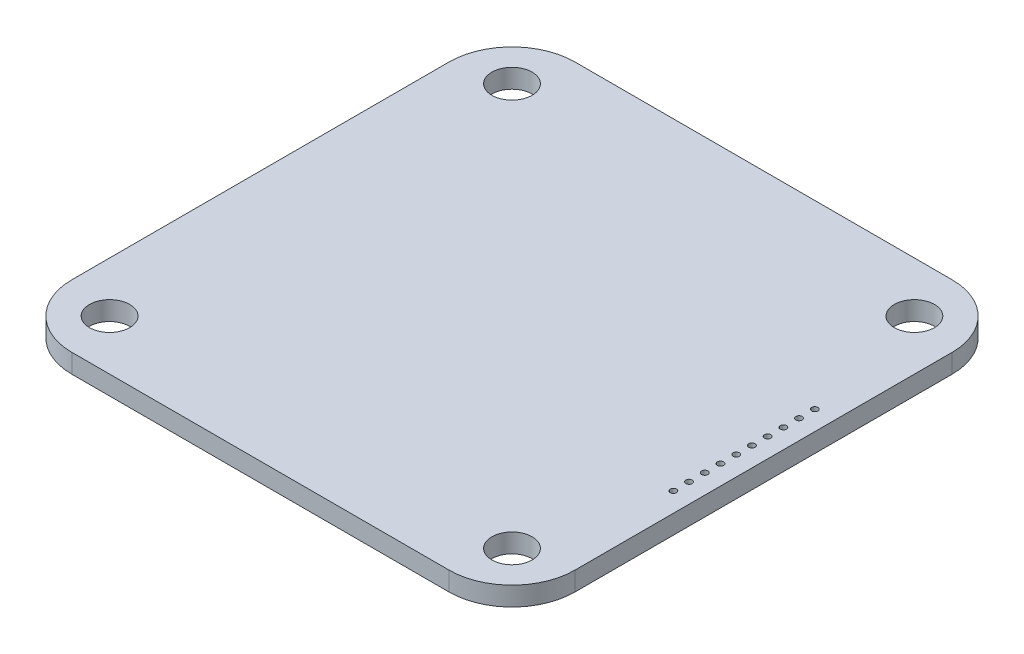
ISO-10303-21;
HEADER;
FILE_DESCRIPTION(('STEP AP214'),'2;1');
FILE_NAME('part.step','',(''),(''),'','','');
FILE_SCHEMA(('AUTOMOTIVE_DESIGN { 1 0 10303 214 1 1 1 1 }'));
ENDSEC;
DATA;
#1=APPLICATION_CONTEXT('core data for automotive mechanical design processes');
#2=APPLICATION_PROTOCOL_DEFINITION('international standard','automotive_design',2000,#1);
#3=PRODUCT_CONTEXT('',#1,'mechanical');
#4=PRODUCT('Part','Part','',(#3));
#5=PRODUCT_RELATED_PRODUCT_CATEGORY('part','',(#4));
#6=PRODUCT_DEFINITION_FORMATION('','',#4);
#7=PRODUCT_DEFINITION_CONTEXT('part definition',#1,'design');
#8=PRODUCT_DEFINITION('design','',#6,#7);
#9=PRODUCT_DEFINITION_SHAPE('','',#8);
#10=(LENGTH_UNIT() NAMED_UNIT(*) SI_UNIT(.MILLI.,.METRE.));
#11=(NAMED_UNIT(*) PLANE_ANGLE_UNIT() SI_UNIT($,.RADIAN.));
#12=(NAMED_UNIT(*) SI_UNIT($,.STERADIAN.) SOLID_ANGLE_UNIT());
#13=UNCERTAINTY_MEASURE_WITH_UNIT(LENGTH_MEASURE(1.E-05),#10,'distance_accuracy_value','');
#14=(GEOMETRIC_REPRESENTATION_CONTEXT(3) GLOBAL_UNCERTAINTY_ASSIGNED_CONTEXT((#13)) GLOBAL_UNIT_ASSIGNED_CONTEXT((#10,
#11,#12)) REPRESENTATION_CONTEXT('',''));
#15=CARTESIAN_POINT('',(0.,0.,0.));
#16=DIRECTION('',(0.,0.,1.));
#17=DIRECTION('',(1.,0.,0.));
#18=AXIS2_PLACEMENT_3D('',#15,#16,#17);
#19=CARTESIAN_POINT('',(-10.8501032025423,-7.71899899933052,22.49633549216));
#20=DIRECTION('',(0.,1.,0.));
#21=DIRECTION('',(0.,0.,1.));
#22=AXIS2_PLACEMENT_3D('',#19,#20,#21);
#23=CYLINDRICAL_SURFACE('',#22,1.6);
#24=CARTESIAN_POINT('',(-10.8501032025423,-7.76499899933052,22.49633549216));
#25=DIRECTION('',(0.,1.,0.));
#26=DIRECTION('',(0.,0.,1.));
#27=AXIS2_PLACEMENT_3D('',#24,#25,#26);
#28=CIRCLE('',#27,1.6);
#29=CARTESIAN_POINT('',(-10.8501032025423,-7.76499899933052,24.09633549216));
#30=VERTEX_POINT('',#29);
#31=EDGE_CURVE('E259',#30,#30,#28,.T.);
#32=ORIENTED_EDGE('',*,*,#31,.T.);
#33=EDGE_LOOP('',(#32));
#34=FACE_BOUND('',#33,.T.);
#35=CARTESIAN_POINT('',(-10.8501032025423,-9.27499899933052,22.49633549216));
#36=DIRECTION('',(0.,1.,0.));
#37=DIRECTION('',(0.,0.,1.));
#38=AXIS2_PLACEMENT_3D('',#35,#36,#37);
#39=CIRCLE('',#38,1.6);
#40=CARTESIAN_POINT('',(-10.8501032025423,-9.27499899933052,24.09633549216));
#41=VERTEX_POINT('',#40);
#42=EDGE_CURVE('E225',#41,#41,#39,.T.);
#43=ORIENTED_EDGE('',*,*,#42,.F.);
#44=EDGE_LOOP('',(#43));
#45=FACE_BOUND('',#44,.T.);
#46=ADVANCED_FACE('F16',(#34,#45),#23,.F.);
#47=CARTESIAN_POINT('',(21.1498967974577,-7.7189989993306,22.49633549216));
#48=DIRECTION('',(0.,1.,0.));
#49=DIRECTION('',(0.,0.,1.));
#50=AXIS2_PLACEMENT_3D('',#47,#48,#49);
#51=CYLINDRICAL_SURFACE('',#50,1.6);
#52=CARTESIAN_POINT('',(21.1498967974577,-7.76499899933061,22.49633549216));
#53=DIRECTION('',(0.,1.,0.));
#54=DIRECTION('',(0.,0.,1.));
#55=AXIS2_PLACEMENT_3D('',#52,#53,#54);
#56=CIRCLE('',#55,1.6);
#57=CARTESIAN_POINT('',(21.1498967974577,-7.76499899933061,24.09633549216));
#58=VERTEX_POINT('',#57);
#59=EDGE_CURVE('E254',#58,#58,#56,.T.);
#60=ORIENTED_EDGE('',*,*,#59,.T.);
#61=EDGE_LOOP('',(#60));
#62=FACE_BOUND('',#61,.T.);
#63=CARTESIAN_POINT('',(21.1498967974577,-9.27499899933061,22.49633549216));
#64=DIRECTION('',(0.,1.,0.));
#65=DIRECTION('',(0.,0.,1.));
#66=AXIS2_PLACEMENT_3D('',#63,#64,#65);
#67=CIRCLE('',#66,1.6);
#68=CARTESIAN_POINT('',(21.1498967974577,-9.27499899933061,24.09633549216));
#69=VERTEX_POINT('',#68);
#70=EDGE_CURVE('E226',#69,#69,#67,.T.);
#71=ORIENTED_EDGE('',*,*,#70,.F.);
#72=EDGE_LOOP('',(#71));
#73=FACE_BOUND('',#72,.T.);
#74=ADVANCED_FACE('F340',(#62,#73),#51,.F.);
#75=CARTESIAN_POINT('',(23.6048967974577,-7.71899899933061,32.87133549216));
#76=DIRECTION('',(0.,1.,0.));
#77=DIRECTION('',(0.,0.,1.));
#78=AXIS2_PLACEMENT_3D('',#75,#76,#77);
#79=CYLINDRICAL_SURFACE('',#78,0.25);
#80=CARTESIAN_POINT('',(23.6048967974577,-7.76499899933061,32.87133549216));
#81=DIRECTION('',(0.,1.,0.));
#82=DIRECTION('',(0.,0.,1.));
#83=AXIS2_PLACEMENT_3D('',#80,#81,#82);
#84=CIRCLE('',#83,0.25);
#85=CARTESIAN_POINT('',(23.6048967974577,-7.76499899933061,33.12133549216));
#86=VERTEX_POINT('',#85);
#87=EDGE_CURVE('E253',#86,#86,#84,.T.);
#88=ORIENTED_EDGE('',*,*,#87,.T.);
#89=EDGE_LOOP('',(#88));
#90=FACE_BOUND('',#89,.T.);
#91=CARTESIAN_POINT('',(23.6048967974577,-9.27499899933061,32.87133549216));
#92=DIRECTION('',(0.,1.,0.));
#93=DIRECTION('',(0.,0.,1.));
#94=AXIS2_PLACEMENT_3D('',#91,#92,#93);
#95=CIRCLE('',#94,0.25);
#96=CARTESIAN_POINT('',(23.6048967974577,-9.27499899933061,33.12133549216));
#97=VERTEX_POINT('',#96);
#98=EDGE_CURVE('E250',#97,#97,#95,.T.);
#99=ORIENTED_EDGE('',*,*,#98,.F.);
#100=EDGE_LOOP('',(#99));
#101=FACE_BOUND('',#100,.T.);
#102=ADVANCED_FACE('F343',(#90,#101),#79,.F.);
#103=CARTESIAN_POINT('',(23.6048967974577,-7.71899899933061,34.12133449216));
#104=DIRECTION('',(0.,1.,0.));
#105=DIRECTION('',(0.,0.,1.));
#106=AXIS2_PLACEMENT_3D('',#103,#104,#105);
#107=CYLINDRICAL_SURFACE('',#106,0.25);
#108=CARTESIAN_POINT('',(23.6048967974577,-7.76499899933061,34.12133449216));
#109=DIRECTION('',(0.,1.,0.));
#110=DIRECTION('',(0.,0.,1.));
#111=AXIS2_PLACEMENT_3D('',#108,#109,#110);
#112=CIRCLE('',#111,0.25);
#113=CARTESIAN_POINT('',(23.6048967974577,-7.76499899933061,34.37133449216));
#114=VERTEX_POINT('',#113);
#115=EDGE_CURVE('E245',#114,#114,#112,.T.);
#116=ORIENTED_EDGE('',*,*,#115,.T.);
#117=EDGE_LOOP('',(#116));
#118=FACE_BOUND('',#117,.T.);
#119=CARTESIAN_POINT('',(23.6048967974577,-9.27499899933061,34.12133449216));
#120=DIRECTION('',(0.,1.,0.));
#121=DIRECTION('',(0.,0.,1.));
#122=AXIS2_PLACEMENT_3D('',#119,#120,#121);
#123=CIRCLE('',#122,0.25);
#124=CARTESIAN_POINT('',(23.6048967974577,-9.27499899933061,34.37133449216));
#125=VERTEX_POINT('',#124);
#126=EDGE_CURVE('E242',#125,#125,#123,.T.);
#127=ORIENTED_EDGE('',*,*,#126,.F.);
#128=EDGE_LOOP('',(#127));
#129=FACE_BOUND('',#128,.T.);
#130=ADVANCED_FACE('F425',(#118,#129),#107,.F.);
#131=CARTESIAN_POINT('',(23.6048967974577,-7.71899899933061,35.37133549216));
#132=DIRECTION('',(0.,1.,0.));
#133=DIRECTION('',(0.,0.,1.));
#134=AXIS2_PLACEMENT_3D('',#131,#132,#133);
#135=CYLINDRICAL_SURFACE('',#134,0.25);
#136=CARTESIAN_POINT('',(23.6048967974577,-7.76499899933061,35.37133549216));
#137=DIRECTION('',(0.,1.,0.));
#138=DIRECTION('',(0.,0.,1.));
#139=AXIS2_PLACEMENT_3D('',#136,#137,#138);
#140=CIRCLE('',#139,0.25);
#141=CARTESIAN_POINT('',(23.6048967974577,-7.76499899933061,35.62133549216));
#142=VERTEX_POINT('',#141);
#143=EDGE_CURVE('E238',#142,#142,#140,.T.);
#144=ORIENTED_EDGE('',*,*,#143,.T.);
#145=EDGE_LOOP('',(#144));
#146=FACE_BOUND('',#145,.T.);
#147=CARTESIAN_POINT('',(23.6048967974577,-9.27499899933061,35.37133549216));
#148=DIRECTION('',(0.,1.,0.));
#149=DIRECTION('',(0.,0.,1.));
#150=AXIS2_PLACEMENT_3D('',#147,#148,#149);
#151=CIRCLE('',#150,0.25);
#152=CARTESIAN_POINT('',(23.6048967974577,-9.27499899933061,35.62133549216));
#153=VERTEX_POINT('',#152);
#154=EDGE_CURVE('E164',#153,#153,#151,.T.);
#155=ORIENTED_EDGE('',*,*,#154,.F.);
#156=EDGE_LOOP('',(#155));
#157=FACE_BOUND('',#156,.T.);
#158=ADVANCED_FACE('F416',(#146,#157),#135,.F.);
#159=CARTESIAN_POINT('',(23.6048967974577,-7.71899899933061,36.62133449216));
#160=DIRECTION('',(0.,1.,0.));
#161=DIRECTION('',(0.,0.,1.));
#162=AXIS2_PLACEMENT_3D('',#159,#160,#161);
#163=CYLINDRICAL_SURFACE('',#162,0.25);
#164=CARTESIAN_POINT('',(23.6048967974577,-7.76499899933061,36.62133449216));
#165=DIRECTION('',(0.,1.,0.));
#166=DIRECTION('',(0.,0.,1.));
#167=AXIS2_PLACEMENT_3D('',#164,#165,#166);
#168=CIRCLE('',#167,0.25);
#169=CARTESIAN_POINT('',(23.6048967974577,-7.76499899933061,36.87133449216));
#170=VERTEX_POINT('',#169);
#171=EDGE_CURVE('E231',#170,#170,#168,.T.);
#172=ORIENTED_EDGE('',*,*,#171,.T.);
#173=EDGE_LOOP('',(#172));
#174=FACE_BOUND('',#173,.T.);
#175=CARTESIAN_POINT('',(23.6048967974577,-9.27499899933061,36.62133449216));
#176=DIRECTION('',(0.,1.,0.));
#177=DIRECTION('',(0.,0.,1.));
#178=AXIS2_PLACEMENT_3D('',#175,#176,#177);
#179=CIRCLE('',#178,0.25);
#180=CARTESIAN_POINT('',(23.6048967974577,-9.27499899933061,36.87133449216));
#181=VERTEX_POINT('',#180);
#182=EDGE_CURVE('E161',#181,#181,#179,.T.);
#183=ORIENTED_EDGE('',*,*,#182,.F.);
#184=EDGE_LOOP('',(#183));
#185=FACE_BOUND('',#184,.T.);
#186=ADVANCED_FACE('F412',(#174,#185),#163,.F.);
#187=CARTESIAN_POINT('',(23.6048967974577,-7.71899899933061,37.87133549216));
#188=DIRECTION('',(0.,1.,0.));
#189=DIRECTION('',(0.,0.,1.));
#190=AXIS2_PLACEMENT_3D('',#187,#188,#189);
#191=CYLINDRICAL_SURFACE('',#190,0.25);
#192=CARTESIAN_POINT('',(23.6048967974577,-7.76499899933061,37.87133549216));
#193=DIRECTION('',(0.,1.,0.));
#194=DIRECTION('',(0.,0.,1.));
#195=AXIS2_PLACEMENT_3D('',#192,#193,#194);
#196=CIRCLE('',#195,0.25);
#197=CARTESIAN_POINT('',(23.6048967974577,-7.76499899933061,38.12133549216));
#198=VERTEX_POINT('',#197);
#199=EDGE_CURVE('E230',#198,#198,#196,.T.);
#200=ORIENTED_EDGE('',*,*,#199,.T.);
#201=EDGE_LOOP('',(#200));
#202=FACE_BOUND('',#201,.T.);
#203=CARTESIAN_POINT('',(23.6048967974577,-9.27499899933061,37.87133549216));
#204=DIRECTION('',(0.,1.,0.));
#205=DIRECTION('',(0.,0.,1.));
#206=AXIS2_PLACEMENT_3D('',#203,#204,#205);
#207=CIRCLE('',#206,0.25);
#208=CARTESIAN_POINT('',(23.6048967974577,-9.27499899933061,38.12133549216));
#209=VERTEX_POINT('',#208);
#210=EDGE_CURVE('E167',#209,#209,#207,.T.);
#211=ORIENTED_EDGE('',*,*,#210,.F.);
#212=EDGE_LOOP('',(#211));
#213=FACE_BOUND('',#212,.T.);
#214=ADVANCED_FACE('F409',(#202,#213),#191,.F.);
#215=CARTESIAN_POINT('',(-10.8501032025423,-7.71899899933052,54.49633549216));
#216=DIRECTION('',(0.,1.,0.));
#217=DIRECTION('',(0.,0.,1.));
#218=AXIS2_PLACEMENT_3D('',#215,#216,#217);
#219=CYLINDRICAL_SURFACE('',#218,1.6);
#220=CARTESIAN_POINT('',(-10.8501032025423,-7.76499899933052,54.49633549216));
#221=DIRECTION('',(0.,1.,0.));
#222=DIRECTION('',(0.,0.,1.));
#223=AXIS2_PLACEMENT_3D('',#220,#221,#222);
#224=CIRCLE('',#223,1.6);
#225=CARTESIAN_POINT('',(-10.8501032025423,-7.76499899933052,56.09633549216));
#226=VERTEX_POINT('',#225);
#227=EDGE_CURVE('E222',#226,#226,#224,.T.);
#228=ORIENTED_EDGE('',*,*,#227,.T.);
#229=EDGE_LOOP('',(#228));
#230=FACE_BOUND('',#229,.T.);
#231=CARTESIAN_POINT('',(-10.8501032025423,-9.27499899933052,54.49633549216));
#232=DIRECTION('',(0.,1.,0.));
#233=DIRECTION('',(0.,0.,1.));
#234=AXIS2_PLACEMENT_3D('',#231,#232,#233);
#235=CIRCLE('',#234,1.6);
#236=CARTESIAN_POINT('',(-10.8501032025423,-9.27499899933052,56.09633549216));
#237=VERTEX_POINT('',#236);
#238=EDGE_CURVE('E153',#237,#237,#235,.T.);
#239=ORIENTED_EDGE('',*,*,#238,.F.);
#240=EDGE_LOOP('',(#239));
#241=FACE_BOUND('',#240,.T.);
#242=ADVANCED_FACE('F406',(#230,#241),#219,.F.);
#243=CARTESIAN_POINT('',(23.6048967974577,-7.71899899933061,39.12133449216));
#244=DIRECTION('',(0.,1.,0.));
#245=DIRECTION('',(0.,0.,1.));
#246=AXIS2_PLACEMENT_3D('',#243,#244,#245);
#247=CYLINDRICAL_SURFACE('',#246,0.25);
#248=CARTESIAN_POINT('',(23.6048967974577,-7.76499899933061,39.12133449216));
#249=DIRECTION('',(0.,1.,0.));
#250=DIRECTION('',(0.,0.,1.));
#251=AXIS2_PLACEMENT_3D('',#248,#249,#250);
#252=CIRCLE('',#251,0.25);
#253=CARTESIAN_POINT('',(23.6048967974577,-7.76499899933061,39.37133449216));
#254=VERTEX_POINT('',#253);
#255=EDGE_CURVE('E220',#254,#254,#252,.T.);
#256=ORIENTED_EDGE('',*,*,#255,.T.);
#257=EDGE_LOOP('',(#256));
#258=FACE_BOUND('',#257,.T.);
#259=CARTESIAN_POINT('',(23.6048967974577,-9.27499899933061,39.12133449216));
#260=DIRECTION('',(0.,1.,0.));
#261=DIRECTION('',(0.,0.,1.));
#262=AXIS2_PLACEMENT_3D('',#259,#260,#261);
#263=CIRCLE('',#262,0.25);
#264=CARTESIAN_POINT('',(23.6048967974577,-9.27499899933061,39.37133449216));
#265=VERTEX_POINT('',#264);
#266=EDGE_CURVE('E149',#265,#265,#263,.T.);
#267=ORIENTED_EDGE('',*,*,#266,.F.);
#268=EDGE_LOOP('',(#267));
#269=FACE_BOUND('',#268,.T.);
#270=ADVANCED_FACE('F403',(#258,#269),#247,.F.);
#271=CARTESIAN_POINT('',(23.6048967974577,-7.71899899933061,40.37133549216));
#272=DIRECTION('',(0.,1.,0.));
#273=DIRECTION('',(0.,0.,1.));
#274=AXIS2_PLACEMENT_3D('',#271,#272,#273);
#275=CYLINDRICAL_SURFACE('',#274,0.25);
#276=CARTESIAN_POINT('',(23.6048967974577,-7.76499899933061,40.37133549216));
#277=DIRECTION('',(0.,1.,0.));
#278=DIRECTION('',(0.,0.,1.));
#279=AXIS2_PLACEMENT_3D('',#276,#277,#278);
#280=CIRCLE('',#279,0.25);
#281=CARTESIAN_POINT('',(23.6048967974577,-7.76499899933061,40.62133549216));
#282=VERTEX_POINT('',#281);
#283=EDGE_CURVE('E213',#282,#282,#280,.T.);
#284=ORIENTED_EDGE('',*,*,#283,.T.);
#285=EDGE_LOOP('',(#284));
#286=FACE_BOUND('',#285,.T.);
#287=CARTESIAN_POINT('',(23.6048967974577,-9.27499899933061,40.37133549216));
#288=DIRECTION('',(0.,1.,0.));
#289=DIRECTION('',(0.,0.,1.));
#290=AXIS2_PLACEMENT_3D('',#287,#288,#289);
#291=CIRCLE('',#290,0.25);
#292=CARTESIAN_POINT('',(23.6048967974577,-9.27499899933061,40.62133549216));
#293=VERTEX_POINT('',#292);
#294=EDGE_CURVE('E152',#293,#293,#291,.T.);
#295=ORIENTED_EDGE('',*,*,#294,.F.);
#296=EDGE_LOOP('',(#295));
#297=FACE_BOUND('',#296,.T.);
#298=ADVANCED_FACE('F405',(#286,#297),#275,.F.);
#299=CARTESIAN_POINT('',(23.6048967974577,-7.71899899933061,41.62133549216));
#300=DIRECTION('',(0.,1.,0.));
#301=DIRECTION('',(0.,0.,1.));
#302=AXIS2_PLACEMENT_3D('',#299,#300,#301);
#303=CYLINDRICAL_SURFACE('',#302,0.25);
#304=CARTESIAN_POINT('',(23.6048967974577,-7.76499899933061,41.62133549216));
#305=DIRECTION('',(0.,1.,0.));
#306=DIRECTION('',(0.,0.,1.));
#307=AXIS2_PLACEMENT_3D('',#304,#305,#306);
#308=CIRCLE('',#307,0.25);
#309=CARTESIAN_POINT('',(23.6048967974577,-7.76499899933061,41.87133549216));
#310=VERTEX_POINT('',#309);
#311=EDGE_CURVE('E207',#310,#310,#308,.T.);
#312=ORIENTED_EDGE('',*,*,#311,.T.);
#313=EDGE_LOOP('',(#312));
#314=FACE_BOUND('',#313,.T.);
#315=CARTESIAN_POINT('',(23.6048967974577,-9.27499899933061,41.62133549216));
#316=DIRECTION('',(0.,1.,0.));
#317=DIRECTION('',(0.,0.,1.));
#318=AXIS2_PLACEMENT_3D('',#315,#316,#317);
#319=CIRCLE('',#318,0.25);
#320=CARTESIAN_POINT('',(23.6048967974577,-9.27499899933061,41.87133549216));
#321=VERTEX_POINT('',#320);
#322=EDGE_CURVE('E288',#321,#321,#319,.T.);
#323=ORIENTED_EDGE('',*,*,#322,.F.);
#324=EDGE_LOOP('',(#323));
#325=FACE_BOUND('',#324,.T.);
#326=ADVANCED_FACE('F400',(#314,#325),#303,.F.);
#327=CARTESIAN_POINT('',(23.6048967974577,-7.71899899933061,42.87133549216));
#328=DIRECTION('',(0.,1.,0.));
#329=DIRECTION('',(0.,0.,1.));
#330=AXIS2_PLACEMENT_3D('',#327,#328,#329);
#331=CYLINDRICAL_SURFACE('',#330,0.25);
#332=CARTESIAN_POINT('',(23.6048967974577,-7.76499899933061,42.87133549216));
#333=DIRECTION('',(0.,1.,0.));
#334=DIRECTION('',(0.,0.,1.));
#335=AXIS2_PLACEMENT_3D('',#332,#333,#334);
#336=CIRCLE('',#335,0.25);
#337=CARTESIAN_POINT('',(23.6048967974577,-7.76499899933061,43.12133549216));
#338=VERTEX_POINT('',#337);
#339=EDGE_CURVE('E202',#338,#338,#336,.T.);
#340=ORIENTED_EDGE('',*,*,#339,.T.);
#341=EDGE_LOOP('',(#340));
#342=FACE_BOUND('',#341,.T.);
#343=CARTESIAN_POINT('',(23.6048967974577,-9.27499899933061,42.87133549216));
#344=DIRECTION('',(0.,1.,0.));
#345=DIRECTION('',(0.,0.,1.));
#346=AXIS2_PLACEMENT_3D('',#343,#344,#345);
#347=CIRCLE('',#346,0.25);
#348=CARTESIAN_POINT('',(23.6048967974577,-9.27499899933061,43.12133549216));
#349=VERTEX_POINT('',#348);
#350=EDGE_CURVE('E287',#349,#349,#347,.T.);
#351=ORIENTED_EDGE('',*,*,#350,.F.);
#352=EDGE_LOOP('',(#351));
#353=FACE_BOUND('',#352,.T.);
#354=ADVANCED_FACE('F386',(#342,#353),#331,.F.);
#355=CARTESIAN_POINT('',(23.6048967974577,-7.71899899933061,44.12133549216));
#356=DIRECTION('',(0.,1.,0.));
#357=DIRECTION('',(0.,0.,1.));
#358=AXIS2_PLACEMENT_3D('',#355,#356,#357);
#359=CYLINDRICAL_SURFACE('',#358,0.25);
#360=CARTESIAN_POINT('',(23.6048967974577,-7.76499899933061,44.12133549216));
#361=DIRECTION('',(0.,1.,0.));
#362=DIRECTION('',(0.,0.,1.));
#363=AXIS2_PLACEMENT_3D('',#360,#361,#362);
#364=CIRCLE('',#363,0.25);
#365=CARTESIAN_POINT('',(23.6048967974577,-7.76499899933061,44.37133549216));
#366=VERTEX_POINT('',#365);
#367=EDGE_CURVE('E194',#366,#366,#364,.T.);
#368=ORIENTED_EDGE('',*,*,#367,.T.);
#369=EDGE_LOOP('',(#368));
#370=FACE_BOUND('',#369,.T.);
#371=CARTESIAN_POINT('',(23.6048967974577,-9.27499899933061,44.12133549216));
#372=DIRECTION('',(0.,1.,0.));
#373=DIRECTION('',(0.,0.,1.));
#374=AXIS2_PLACEMENT_3D('',#371,#372,#373);
#375=CIRCLE('',#374,0.25);
#376=CARTESIAN_POINT('',(23.6048967974577,-9.27499899933061,44.37133549216));
#377=VERTEX_POINT('',#376);
#378=EDGE_CURVE('E282',#377,#377,#375,.T.);
#379=ORIENTED_EDGE('',*,*,#378,.F.);
#380=EDGE_LOOP('',(#379));
#381=FACE_BOUND('',#380,.T.);
#382=ADVANCED_FACE('F381',(#370,#381),#359,.F.);
#383=CARTESIAN_POINT('',(21.1498967974577,-7.7189989993306,54.49633549216));
#384=DIRECTION('',(0.,1.,0.));
#385=DIRECTION('',(0.,0.,1.));
#386=AXIS2_PLACEMENT_3D('',#383,#384,#385);
#387=CYLINDRICAL_SURFACE('',#386,1.6);
#388=CARTESIAN_POINT('',(21.1498967974577,-7.76499899933061,54.49633549216));
#389=DIRECTION('',(0.,1.,0.));
#390=DIRECTION('',(0.,0.,1.));
#391=AXIS2_PLACEMENT_3D('',#388,#389,#390);
#392=CIRCLE('',#391,1.6);
#393=CARTESIAN_POINT('',(21.1498967974577,-7.76499899933061,56.09633549216));
#394=VERTEX_POINT('',#393);
#395=EDGE_CURVE('E191',#394,#394,#392,.T.);
#396=ORIENTED_EDGE('',*,*,#395,.T.);
#397=EDGE_LOOP('',(#396));
#398=FACE_BOUND('',#397,.T.);
#399=CARTESIAN_POINT('',(21.1498967974577,-9.27499899933061,54.49633549216));
#400=DIRECTION('',(0.,1.,0.));
#401=DIRECTION('',(0.,0.,1.));
#402=AXIS2_PLACEMENT_3D('',#399,#400,#401);
#403=CIRCLE('',#402,1.6);
#404=CARTESIAN_POINT('',(21.1498967974577,-9.27499899933061,56.09633549216));
#405=VERTEX_POINT('',#404);
#406=EDGE_CURVE('E279',#405,#405,#403,.T.);
#407=ORIENTED_EDGE('',*,*,#406,.F.);
#408=EDGE_LOOP('',(#407));
#409=FACE_BOUND('',#408,.T.);
#410=ADVANCED_FACE('F377',(#398,#409),#387,.F.);
#411=CARTESIAN_POINT('',(20.1498971186177,-7.7649989993306,53.49633581332));
#412=DIRECTION('',(0.,1.,0.));
#413=DIRECTION('',(-6.42331428786046E-08,0.,1.));
#414=AXIS2_PLACEMENT_3D('',#411,#412,#413);
#415=CYLINDRICAL_SURFACE('',#414,4.999999678834);
#416=DIRECTION('',(0.,-1.,0.));
#417=VECTOR('',#416,1.);
#418=CARTESIAN_POINT('',(20.1498967974577,-7.7649989993306,58.49633549216));
#419=LINE('',#418,#417);
#420=CARTESIAN_POINT('',(20.1498967974577,-7.7649989993306,58.49633549216));
#421=VERTEX_POINT('',#420);
#422=CARTESIAN_POINT('',(20.1498967974577,-9.2749989993306,58.49633549216));
#423=VERTEX_POINT('',#422);
#424=EDGE_CURVE('E11',#421,#423,#419,.T.);
#425=ORIENTED_EDGE('',*,*,#424,.T.);
#426=CARTESIAN_POINT('',(20.1498971186177,-9.2749989993306,53.49633581332));
#427=DIRECTION('',(0.,1.,0.));
#428=DIRECTION('',(-6.42331428786046E-08,0.,1.));
#429=AXIS2_PLACEMENT_3D('',#426,#427,#428);
#430=CIRCLE('',#429,4.999999678834);
#431=CARTESIAN_POINT('',(25.1498967974577,-9.27499899933062,53.49633549216));
#432=VERTEX_POINT('',#431);
#433=EDGE_CURVE('E267',#423,#432,#430,.T.);
#434=ORIENTED_EDGE('',*,*,#433,.T.);
#435=DIRECTION('',(0.,-1.,0.));
#436=VECTOR('',#435,1.);
#437=CARTESIAN_POINT('',(25.1498967974577,-7.76499899933062,53.49633549216));
#438=LINE('',#437,#436);
#439=CARTESIAN_POINT('',(25.1498967974577,-7.76499899933062,53.49633549216));
#440=VERTEX_POINT('',#439);
#441=EDGE_CURVE('E24',#440,#432,#438,.T.);
#442=ORIENTED_EDGE('',*,*,#441,.F.);
#443=CARTESIAN_POINT('',(20.1498971186177,-7.7649989993306,53.49633581332));
#444=DIRECTION('',(0.,1.,0.));
#445=DIRECTION('',(-6.42331428786046E-08,0.,1.));
#446=AXIS2_PLACEMENT_3D('',#443,#444,#445);
#447=CIRCLE('',#446,4.999999678834);
#448=EDGE_CURVE('E186',#421,#440,#447,.T.);
#449=ORIENTED_EDGE('',*,*,#448,.F.);
#450=EDGE_LOOP('',(#425,#434,#442,#449));
#451=FACE_BOUND('',#450,.T.);
#452=ADVANCED_FACE('F320',(#451),#415,.T.);
#453=CARTESIAN_POINT('',(-9.85010320254226,-7.76499899933052,58.49633549216));
#454=DIRECTION('',(0.,0.,1.));
#455=DIRECTION('',(1.,0.,0.));
#456=AXIS2_PLACEMENT_3D('',#453,#454,#455);
#457=PLANE('',#456);
#458=DIRECTION('',(0.,-1.,0.));
#459=VECTOR('',#458,1.);
#460=CARTESIAN_POINT('',(-9.85010320254226,-7.76499899933052,58.49633549216));
#461=LINE('',#460,#459);
#462=CARTESIAN_POINT('',(-9.85010320254226,-7.76499899933052,58.49633549216));
#463=VERTEX_POINT('',#462);
#464=CARTESIAN_POINT('',(-9.85010320254227,-9.27499899933052,58.49633549216));
#465=VERTEX_POINT('',#464);
#466=EDGE_CURVE('E38',#463,#465,#461,.T.);
#467=ORIENTED_EDGE('',*,*,#466,.T.);
#468=DIRECTION('',(1.,0.,0.));
#469=VECTOR('',#468,1.);
#470=CARTESIAN_POINT('',(-9.85010320254227,-9.27499899933052,58.49633549216));
#471=LINE('',#470,#469);
#472=EDGE_CURVE('E275',#465,#423,#471,.T.);
#473=ORIENTED_EDGE('',*,*,#472,.T.);
#474=ORIENTED_EDGE('',*,*,#424,.F.);
#475=DIRECTION('',(1.,0.,0.));
#476=VECTOR('',#475,1.);
#477=CARTESIAN_POINT('',(-9.85010320254226,-7.76499899933052,58.49633549216));
#478=LINE('',#477,#476);
#479=EDGE_CURVE('E168',#463,#421,#478,.T.);
#480=ORIENTED_EDGE('',*,*,#479,.F.);
#481=EDGE_LOOP('',(#467,#473,#474,#480));
#482=FACE_BOUND('',#481,.T.);
#483=ADVANCED_FACE('F325',(#482),#457,.T.);
#484=CARTESIAN_POINT('',(25.1498967974577,-7.76499899933062,53.49633549216));
#485=DIRECTION('',(1.,0.,0.));
#486=DIRECTION('',(0.,-1.,0.));
#487=AXIS2_PLACEMENT_3D('',#484,#485,#486);
#488=PLANE('',#487);
#489=ORIENTED_EDGE('',*,*,#441,.T.);
#490=DIRECTION('',(0.,0.,-1.));
#491=VECTOR('',#490,1.);
#492=CARTESIAN_POINT('',(25.1498967974577,-9.27499899933062,53.49633549216));
#493=LINE('',#492,#491);
#494=CARTESIAN_POINT('',(25.1498967974577,-9.27499899933062,23.49633549216));
#495=VERTEX_POINT('',#494);
#496=EDGE_CURVE('E266',#432,#495,#493,.T.);
#497=ORIENTED_EDGE('',*,*,#496,.T.);
#498=DIRECTION('',(0.,-1.,0.));
#499=VECTOR('',#498,1.);
#500=CARTESIAN_POINT('',(25.1498967974577,-7.76499899933062,23.49633549216));
#501=LINE('',#500,#499);
#502=CARTESIAN_POINT('',(25.1498967974577,-7.76499899933062,23.49633549216));
#503=VERTEX_POINT('',#502);
#504=EDGE_CURVE('E59',#503,#495,#501,.T.);
#505=ORIENTED_EDGE('',*,*,#504,.F.);
#506=DIRECTION('',(0.,0.,-1.));
#507=VECTOR('',#506,1.);
#508=CARTESIAN_POINT('',(25.1498967974577,-7.76499899933062,53.49633549216));
#509=LINE('',#508,#507);
#510=EDGE_CURVE('E189',#440,#503,#509,.T.);
#511=ORIENTED_EDGE('',*,*,#510,.F.);
#512=EDGE_LOOP('',(#489,#497,#505,#511));
#513=FACE_BOUND('',#512,.T.);
#514=ADVANCED_FACE('F311',(#513),#488,.T.);
#515=CARTESIAN_POINT('',(-9.85010352370827,-7.76499899933052,53.49633581332));
#516=DIRECTION('',(0.,1.,0.));
#517=DIRECTION('',(-1.,0.,-6.42331428786046E-08));
#518=AXIS2_PLACEMENT_3D('',#515,#516,#517);
#519=CYLINDRICAL_SURFACE('',#518,4.999999678834);
#520=DIRECTION('',(0.,-1.,0.));
#521=VECTOR('',#520,1.);
#522=CARTESIAN_POINT('',(-14.8501032025423,-7.76499899933051,53.49633549216));
#523=LINE('',#522,#521);
#524=CARTESIAN_POINT('',(-14.8501032025423,-7.76499899933051,53.49633549216));
#525=VERTEX_POINT('',#524);
#526=CARTESIAN_POINT('',(-14.8501032025423,-9.27499899933051,53.49633549216));
#527=VERTEX_POINT('',#526);
#528=EDGE_CURVE('E158',#525,#527,#523,.T.);
#529=ORIENTED_EDGE('',*,*,#528,.T.);
#530=CARTESIAN_POINT('',(-9.85010352370827,-9.27499899933052,53.49633581332));
#531=DIRECTION('',(0.,1.,0.));
#532=DIRECTION('',(-1.,0.,-6.42331428786046E-08));
#533=AXIS2_PLACEMENT_3D('',#530,#531,#532);
#534=CIRCLE('',#533,4.999999678834);
#535=EDGE_CURVE('E274',#527,#465,#534,.T.);
#536=ORIENTED_EDGE('',*,*,#535,.T.);
#537=ORIENTED_EDGE('',*,*,#466,.F.);
#538=CARTESIAN_POINT('',(-9.85010352370827,-7.76499899933052,53.49633581332));
#539=DIRECTION('',(0.,1.,0.));
#540=DIRECTION('',(-1.,0.,-6.42331428786046E-08));
#541=AXIS2_PLACEMENT_3D('',#538,#539,#540);
#542=CIRCLE('',#541,4.999999678834);
#543=EDGE_CURVE('E170',#525,#463,#542,.T.);
#544=ORIENTED_EDGE('',*,*,#543,.F.);
#545=EDGE_LOOP('',(#529,#536,#537,#544));
#546=FACE_BOUND('',#545,.T.);
#547=ADVANCED_FACE('F324',(#546),#519,.T.);
#548=CARTESIAN_POINT('',(20.1498971186177,-7.7649989993306,23.496335170994));
#549=DIRECTION('',(0.,1.,0.));
#550=DIRECTION('',(1.,0.,6.42331428786046E-08));
#551=AXIS2_PLACEMENT_3D('',#548,#549,#550);
#552=CYLINDRICAL_SURFACE('',#551,4.999999678834);
#553=ORIENTED_EDGE('',*,*,#504,.T.);
#554=CARTESIAN_POINT('',(20.1498971186177,-9.2749989993306,23.496335170994));
#555=DIRECTION('',(0.,1.,0.));
#556=DIRECTION('',(1.,0.,6.42331428786046E-08));
#557=AXIS2_PLACEMENT_3D('',#554,#555,#556);
#558=CIRCLE('',#557,4.999999678834);
#559=CARTESIAN_POINT('',(20.1498967974577,-9.2749989993306,18.49633549216));
#560=VERTEX_POINT('',#559);
#561=EDGE_CURVE('E263',#495,#560,#558,.T.);
#562=ORIENTED_EDGE('',*,*,#561,.T.);
#563=DIRECTION('',(0.,-1.,0.));
#564=VECTOR('',#563,1.);
#565=CARTESIAN_POINT('',(20.1498967974577,-7.7649989993306,18.49633549216));
#566=LINE('',#565,#564);
#567=CARTESIAN_POINT('',(20.1498967974577,-7.7649989993306,18.49633549216));
#568=VERTEX_POINT('',#567);
#569=EDGE_CURVE('E133',#568,#560,#566,.T.);
#570=ORIENTED_EDGE('',*,*,#569,.F.);
#571=CARTESIAN_POINT('',(20.1498971186177,-7.7649989993306,23.496335170994));
#572=DIRECTION('',(0.,1.,0.));
#573=DIRECTION('',(1.,0.,6.42331428786046E-08));
#574=AXIS2_PLACEMENT_3D('',#571,#572,#573);
#575=CIRCLE('',#574,4.999999678834);
#576=EDGE_CURVE('E117',#503,#568,#575,.T.);
#577=ORIENTED_EDGE('',*,*,#576,.F.);
#578=EDGE_LOOP('',(#553,#562,#570,#577));
#579=FACE_BOUND('',#578,.T.);
#580=ADVANCED_FACE('F321',(#579),#552,.T.);
#581=CARTESIAN_POINT('',(5.14989679745773,-9.27499899933056,38.49633549216));
#582=DIRECTION('',(0.,-1.,0.));
#583=DIRECTION('',(-1.,0.,0.));
#584=AXIS2_PLACEMENT_3D('',#581,#582,#583);
#585=PLANE('',#584);
#586=ORIENTED_EDGE('',*,*,#42,.T.);
#587=EDGE_LOOP('',(#586));
#588=FACE_BOUND('',#587,.T.);
#589=ORIENTED_EDGE('',*,*,#70,.T.);
#590=EDGE_LOOP('',(#589));
#591=FACE_BOUND('',#590,.T.);
#592=ORIENTED_EDGE('',*,*,#98,.T.);
#593=EDGE_LOOP('',(#592));
#594=FACE_BOUND('',#593,.T.);
#595=ORIENTED_EDGE('',*,*,#126,.T.);
#596=EDGE_LOOP('',(#595));
#597=FACE_BOUND('',#596,.T.);
#598=ORIENTED_EDGE('',*,*,#154,.T.);
#599=EDGE_LOOP('',(#598));
#600=FACE_BOUND('',#599,.T.);
#601=ORIENTED_EDGE('',*,*,#182,.T.);
#602=EDGE_LOOP('',(#601));
#603=FACE_BOUND('',#602,.T.);
#604=ORIENTED_EDGE('',*,*,#210,.T.);
#605=EDGE_LOOP('',(#604));
#606=FACE_BOUND('',#605,.T.);
#607=ORIENTED_EDGE('',*,*,#238,.T.);
#608=EDGE_LOOP('',(#607));
#609=FACE_BOUND('',#608,.T.);
#610=ORIENTED_EDGE('',*,*,#266,.T.);
#611=EDGE_LOOP('',(#610));
#612=FACE_BOUND('',#611,.T.);
#613=ORIENTED_EDGE('',*,*,#294,.T.);
#614=EDGE_LOOP('',(#613));
#615=FACE_BOUND('',#614,.T.);
#616=ORIENTED_EDGE('',*,*,#322,.T.);
#617=EDGE_LOOP('',(#616));
#618=FACE_BOUND('',#617,.T.);
#619=ORIENTED_EDGE('',*,*,#350,.T.);
#620=EDGE_LOOP('',(#619));
#621=FACE_BOUND('',#620,.T.);
#622=ORIENTED_EDGE('',*,*,#378,.T.);
#623=EDGE_LOOP('',(#622));
#624=FACE_BOUND('',#623,.T.);
#625=ORIENTED_EDGE('',*,*,#406,.T.);
#626=EDGE_LOOP('',(#625));
#627=FACE_BOUND('',#626,.T.);
#628=CARTESIAN_POINT('',(-9.85010352370827,-9.27499899933052,23.496335170994));
#629=DIRECTION('',(0.,1.,0.));
#630=DIRECTION('',(6.42331428786046E-08,0.,-1.));
#631=AXIS2_PLACEMENT_3D('',#628,#629,#630);
#632=CIRCLE('',#631,4.999999678834);
#633=CARTESIAN_POINT('',(-9.85010320254226,-9.27499899933052,18.49633549216));
#634=VERTEX_POINT('',#633);
#635=CARTESIAN_POINT('',(-14.8501032025423,-9.27499899933051,23.49633549216));
#636=VERTEX_POINT('',#635);
#637=EDGE_CURVE('E139',#634,#636,#632,.T.);
#638=ORIENTED_EDGE('',*,*,#637,.F.);
#639=DIRECTION('',(-1.,0.,0.));
#640=VECTOR('',#639,1.);
#641=CARTESIAN_POINT('',(20.1498967974577,-9.2749989993306,18.49633549216));
#642=LINE('',#641,#640);
#643=EDGE_CURVE('E121',#560,#634,#642,.T.);
#644=ORIENTED_EDGE('',*,*,#643,.F.);
#645=ORIENTED_EDGE('',*,*,#561,.F.);
#646=ORIENTED_EDGE('',*,*,#496,.F.);
#647=ORIENTED_EDGE('',*,*,#433,.F.);
#648=ORIENTED_EDGE('',*,*,#472,.F.);
#649=ORIENTED_EDGE('',*,*,#535,.F.);
#650=DIRECTION('',(0.,0.,1.));
#651=VECTOR('',#650,1.);
#652=CARTESIAN_POINT('',(-14.8501032025423,-9.27499899933051,23.49633549216));
#653=LINE('',#652,#651);
#654=EDGE_CURVE('E124',#636,#527,#653,.T.);
#655=ORIENTED_EDGE('',*,*,#654,.F.);
#656=EDGE_LOOP('',(#638,#644,#645,#646,#647,#648,#649,#655));
#657=FACE_BOUND('',#656,.T.);
#658=ADVANCED_FACE('F319',(#588,#591,#594,#597,#600,#603,#606,#609,#612,#615,#618,#621,#624,
#627,#657),#585,.T.);
#659=CARTESIAN_POINT('',(5.14989679745774,-7.76499899933056,38.49633549216));
#660=DIRECTION('',(0.,-1.,0.));
#661=DIRECTION('',(-1.,0.,0.));
#662=AXIS2_PLACEMENT_3D('',#659,#660,#661);
#663=PLANE('',#662);
#664=ORIENTED_EDGE('',*,*,#31,.F.);
#665=EDGE_LOOP('',(#664));
#666=FACE_BOUND('',#665,.T.);
#667=ORIENTED_EDGE('',*,*,#59,.F.);
#668=EDGE_LOOP('',(#667));
#669=FACE_BOUND('',#668,.T.);
#670=ORIENTED_EDGE('',*,*,#87,.F.);
#671=EDGE_LOOP('',(#670));
#672=FACE_BOUND('',#671,.T.);
#673=ORIENTED_EDGE('',*,*,#115,.F.);
#674=EDGE_LOOP('',(#673));
#675=FACE_BOUND('',#674,.T.);
#676=ORIENTED_EDGE('',*,*,#143,.F.);
#677=EDGE_LOOP('',(#676));
#678=FACE_BOUND('',#677,.T.);
#679=ORIENTED_EDGE('',*,*,#171,.F.);
#680=EDGE_LOOP('',(#679));
#681=FACE_BOUND('',#680,.T.);
#682=ORIENTED_EDGE('',*,*,#199,.F.);
#683=EDGE_LOOP('',(#682));
#684=FACE_BOUND('',#683,.T.);
#685=ORIENTED_EDGE('',*,*,#227,.F.);
#686=EDGE_LOOP('',(#685));
#687=FACE_BOUND('',#686,.T.);
#688=ORIENTED_EDGE('',*,*,#255,.F.);
#689=EDGE_LOOP('',(#688));
#690=FACE_BOUND('',#689,.T.);
#691=ORIENTED_EDGE('',*,*,#283,.F.);
#692=EDGE_LOOP('',(#691));
#693=FACE_BOUND('',#692,.T.);
#694=ORIENTED_EDGE('',*,*,#311,.F.);
#695=EDGE_LOOP('',(#694));
#696=FACE_BOUND('',#695,.T.);
#697=ORIENTED_EDGE('',*,*,#339,.F.);
#698=EDGE_LOOP('',(#697));
#699=FACE_BOUND('',#698,.T.);
#700=ORIENTED_EDGE('',*,*,#367,.F.);
#701=EDGE_LOOP('',(#700));
#702=FACE_BOUND('',#701,.T.);
#703=ORIENTED_EDGE('',*,*,#395,.F.);
#704=EDGE_LOOP('',(#703));
#705=FACE_BOUND('',#704,.T.);
#706=CARTESIAN_POINT('',(-9.85010352370826,-7.76499899933052,23.496335170994));
#707=DIRECTION('',(0.,1.,0.));
#708=DIRECTION('',(6.42331428786046E-08,0.,-1.));
#709=AXIS2_PLACEMENT_3D('',#706,#707,#708);
#710=CIRCLE('',#709,4.999999678834);
#711=CARTESIAN_POINT('',(-9.85010320254226,-7.76499899933052,18.49633549216));
#712=VERTEX_POINT('',#711);
#713=CARTESIAN_POINT('',(-14.8501032025423,-7.76499899933051,23.49633549216));
#714=VERTEX_POINT('',#713);
#715=EDGE_CURVE('E111',#712,#714,#710,.T.);
#716=ORIENTED_EDGE('',*,*,#715,.T.);
#717=DIRECTION('',(0.,0.,1.));
#718=VECTOR('',#717,1.);
#719=CARTESIAN_POINT('',(-14.8501032025423,-7.76499899933051,23.49633549216));
#720=LINE('',#719,#718);
#721=EDGE_CURVE('E171',#714,#525,#720,.T.);
#722=ORIENTED_EDGE('',*,*,#721,.T.);
#723=ORIENTED_EDGE('',*,*,#543,.T.);
#724=ORIENTED_EDGE('',*,*,#479,.T.);
#725=ORIENTED_EDGE('',*,*,#448,.T.);
#726=ORIENTED_EDGE('',*,*,#510,.T.);
#727=ORIENTED_EDGE('',*,*,#576,.T.);
#728=DIRECTION('',(-1.,0.,0.));
#729=VECTOR('',#728,1.);
#730=CARTESIAN_POINT('',(20.1498967974577,-7.7649989993306,18.49633549216));
#731=LINE('',#730,#729);
#732=EDGE_CURVE('E109',#568,#712,#731,.T.);
#733=ORIENTED_EDGE('',*,*,#732,.T.);
#734=EDGE_LOOP('',(#716,#722,#723,#724,#725,#726,#727,#733));
#735=FACE_BOUND('',#734,.T.);
#736=ADVANCED_FACE('F115',(#666,#669,#672,#675,#678,#681,#684,#687,#690,#693,#696,#699,#702,
#705,#735),#663,.F.);
#737=CARTESIAN_POINT('',(-14.8501032025423,-7.76499899933051,23.49633549216));
#738=DIRECTION('',(-1.,0.,0.));
#739=DIRECTION('',(0.,0.,1.));
#740=AXIS2_PLACEMENT_3D('',#737,#738,#739);
#741=PLANE('',#740);
#742=DIRECTION('',(0.,-1.,0.));
#743=VECTOR('',#742,1.);
#744=CARTESIAN_POINT('',(-14.8501032025423,-7.76499899933051,23.49633549216));
#745=LINE('',#744,#743);
#746=EDGE_CURVE('E135',#714,#636,#745,.T.);
#747=ORIENTED_EDGE('',*,*,#746,.T.);
#748=ORIENTED_EDGE('',*,*,#654,.T.);
#749=ORIENTED_EDGE('',*,*,#528,.F.);
#750=ORIENTED_EDGE('',*,*,#721,.F.);
#751=EDGE_LOOP('',(#747,#748,#749,#750));
#752=FACE_BOUND('',#751,.T.);
#753=ADVANCED_FACE('F330',(#752),#741,.T.);
#754=CARTESIAN_POINT('',(20.1498967974577,-7.7649989993306,18.49633549216));
#755=DIRECTION('',(0.,0.,-1.));
#756=DIRECTION('',(0.,-1.,0.));
#757=AXIS2_PLACEMENT_3D('',#754,#755,#756);
#758=PLANE('',#757);
#759=ORIENTED_EDGE('',*,*,#569,.T.);
#760=ORIENTED_EDGE('',*,*,#643,.T.);
#761=DIRECTION('',(0.,-1.,0.));
#762=VECTOR('',#761,1.);
#763=CARTESIAN_POINT('',(-9.85010320254226,-7.76499899933052,18.49633549216));
#764=LINE('',#763,#762);
#765=EDGE_CURVE('E129',#712,#634,#764,.T.);
#766=ORIENTED_EDGE('',*,*,#765,.F.);
#767=ORIENTED_EDGE('',*,*,#732,.F.);
#768=EDGE_LOOP('',(#759,#760,#766,#767));
#769=FACE_BOUND('',#768,.T.);
#770=ADVANCED_FACE('F136',(#769),#758,.T.);
#771=CARTESIAN_POINT('',(-9.85010352370826,-7.76499899933052,23.496335170994));
#772=DIRECTION('',(0.,1.,0.));
#773=DIRECTION('',(6.42331428786046E-08,0.,-1.));
#774=AXIS2_PLACEMENT_3D('',#771,#772,#773);
#775=CYLINDRICAL_SURFACE('',#774,4.999999678834);
#776=ORIENTED_EDGE('',*,*,#765,.T.);
#777=ORIENTED_EDGE('',*,*,#637,.T.);
#778=ORIENTED_EDGE('',*,*,#746,.F.);
#779=ORIENTED_EDGE('',*,*,#715,.F.);
#780=EDGE_LOOP('',(#776,#777,#778,#779));
#781=FACE_BOUND('',#780,.T.);
#782=ADVANCED_FACE('F128',(#781),#775,.T.);
#783=CLOSED_SHELL('',(#46,#74,#102,#130,#158,#186,#214,#242,#270,#298,#326,#354,#382,#410,#452,
#483,#514,#547,#580,#658,#736,#753,#770,#782));
#784=MANIFOLD_SOLID_BREP('B1',#783);
#785=ADVANCED_BREP_SHAPE_REPRESENTATION('',(#18,#784),#14);
#786=SHAPE_DEFINITION_REPRESENTATION(#9,#785);
ENDSEC;
END-ISO-10303-21;
